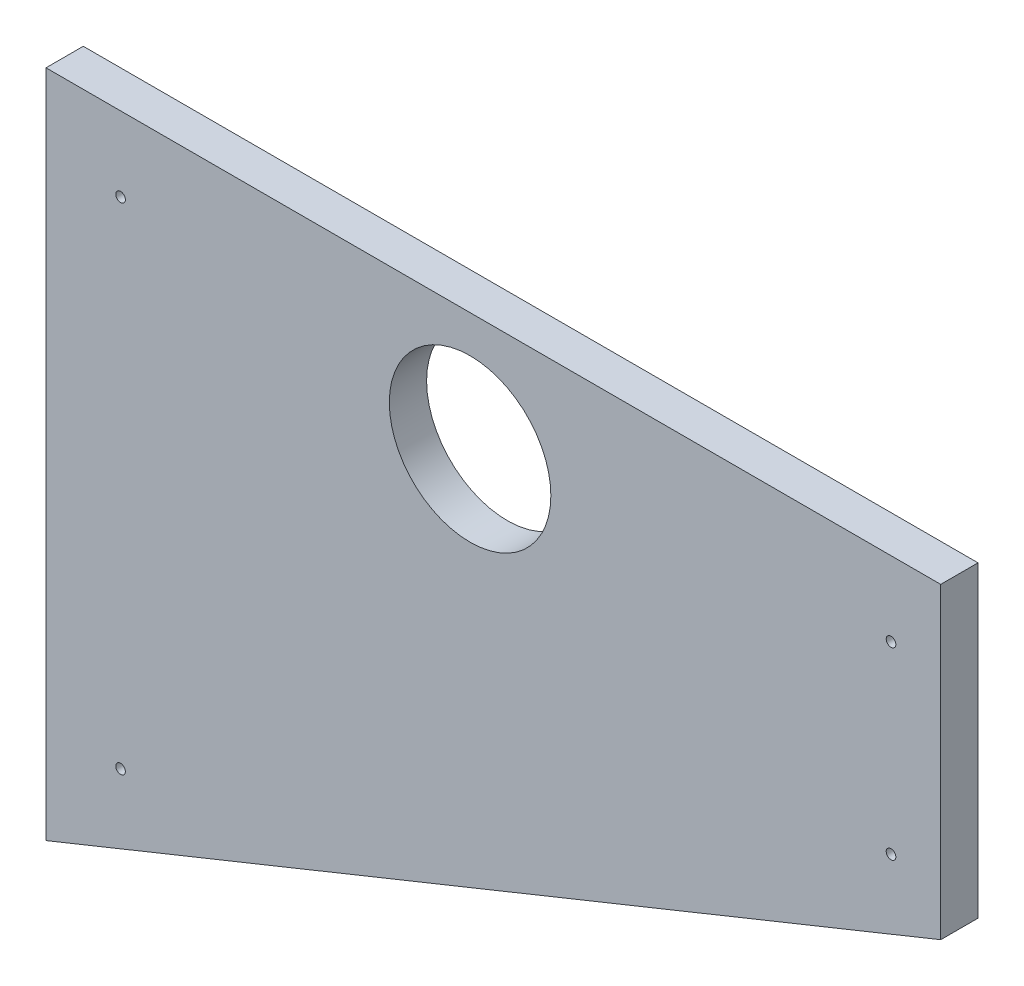
ISO-10303-21;
HEADER;
FILE_DESCRIPTION(('STEP AP214'),'2;1');
FILE_NAME('part.step','',(''),(''),'','','');
FILE_SCHEMA(('AUTOMOTIVE_DESIGN { 1 0 10303 214 1 1 1 1 }'));
ENDSEC;
DATA;
#1=APPLICATION_CONTEXT('core data for automotive mechanical design processes');
#2=APPLICATION_PROTOCOL_DEFINITION('international standard','automotive_design',2000,#1);
#3=PRODUCT_CONTEXT('',#1,'mechanical');
#4=PRODUCT('Part','Part','',(#3));
#5=PRODUCT_RELATED_PRODUCT_CATEGORY('part','',(#4));
#6=PRODUCT_DEFINITION_FORMATION('','',#4);
#7=PRODUCT_DEFINITION_CONTEXT('part definition',#1,'design');
#8=PRODUCT_DEFINITION('design','',#6,#7);
#9=PRODUCT_DEFINITION_SHAPE('','',#8);
#10=(LENGTH_UNIT() NAMED_UNIT(*) SI_UNIT(.MILLI.,.METRE.));
#11=(NAMED_UNIT(*) PLANE_ANGLE_UNIT() SI_UNIT($,.RADIAN.));
#12=(NAMED_UNIT(*) SI_UNIT($,.STERADIAN.) SOLID_ANGLE_UNIT());
#13=UNCERTAINTY_MEASURE_WITH_UNIT(LENGTH_MEASURE(1.E-05),#10,'distance_accuracy_value','');
#14=(GEOMETRIC_REPRESENTATION_CONTEXT(3) GLOBAL_UNCERTAINTY_ASSIGNED_CONTEXT((#13)) GLOBAL_UNIT_ASSIGNED_CONTEXT((#10,
#11,#12)) REPRESENTATION_CONTEXT('',''));
#15=CARTESIAN_POINT('',(0.,0.,0.));
#16=DIRECTION('',(0.,0.,1.));
#17=DIRECTION('',(1.,0.,0.));
#18=AXIS2_PLACEMENT_3D('',#15,#16,#17);
#19=CARTESIAN_POINT('',(3140.70999999981,6983.72999014018,19.05));
#20=DIRECTION('',(0.,-1.,0.));
#21=DIRECTION('',(1.,0.,0.));
#22=AXIS2_PLACEMENT_3D('',#19,#20,#21);
#23=PLANE('',#22);
#24=DIRECTION('',(-1.,0.,0.));
#25=VECTOR('',#24,1.);
#26=CARTESIAN_POINT('',(3140.70999999981,6983.72999014018,0.));
#27=LINE('',#26,#25);
#28=CARTESIAN_POINT('',(3140.70999999981,6983.72999014018,0.));
#29=VERTEX_POINT('',#28);
#30=CARTESIAN_POINT('',(2683.50999999981,6983.72999014018,0.));
#31=VERTEX_POINT('',#30);
#32=EDGE_CURVE('E99',#29,#31,#27,.T.);
#33=ORIENTED_EDGE('',*,*,#32,.T.);
#34=DIRECTION('',(0.,0.,-1.));
#35=VECTOR('',#34,1.);
#36=CARTESIAN_POINT('',(2683.50999999981,6983.72999014018,19.05));
#37=LINE('',#36,#35);
#38=CARTESIAN_POINT('',(2683.50999999981,6983.72999014018,19.05));
#39=VERTEX_POINT('',#38);
#40=EDGE_CURVE('E11',#39,#31,#37,.T.);
#41=ORIENTED_EDGE('',*,*,#40,.F.);
#42=DIRECTION('',(-1.,0.,0.));
#43=VECTOR('',#42,1.);
#44=CARTESIAN_POINT('',(3140.70999999981,6983.72999014018,19.05));
#45=LINE('',#44,#43);
#46=CARTESIAN_POINT('',(3140.70999999981,6983.72999014018,19.05));
#47=VERTEX_POINT('',#46);
#48=EDGE_CURVE('E87',#47,#39,#45,.T.);
#49=ORIENTED_EDGE('',*,*,#48,.F.);
#50=DIRECTION('',(0.,0.,-1.));
#51=VECTOR('',#50,1.);
#52=CARTESIAN_POINT('',(3140.70999999981,6983.72999014018,19.05));
#53=LINE('',#52,#51);
#54=EDGE_CURVE('E95',#47,#29,#53,.T.);
#55=ORIENTED_EDGE('',*,*,#54,.T.);
#56=EDGE_LOOP('',(#33,#41,#49,#55));
#57=FACE_BOUND('',#56,.T.);
#58=ADVANCED_FACE('F36',(#57),#23,.F.);
#59=CARTESIAN_POINT('',(2683.50999999981,6983.72999014018,19.05));
#60=DIRECTION('',(1.,0.,0.));
#61=DIRECTION('',(0.,0.,-1.));
#62=AXIS2_PLACEMENT_3D('',#59,#60,#61);
#63=PLANE('',#62);
#64=DIRECTION('',(0.,-1.,0.));
#65=VECTOR('',#64,1.);
#66=CARTESIAN_POINT('',(2683.50999999981,6983.72999014018,0.));
#67=LINE('',#66,#65);
#68=CARTESIAN_POINT('',(2683.50999999981,6641.74188684795,0.));
#69=VERTEX_POINT('',#68);
#70=EDGE_CURVE('E91',#31,#69,#67,.T.);
#71=ORIENTED_EDGE('',*,*,#70,.T.);
#72=DIRECTION('',(0.,0.,-1.));
#73=VECTOR('',#72,1.);
#74=CARTESIAN_POINT('',(2683.50999999981,6641.74188684795,19.05));
#75=LINE('',#74,#73);
#76=CARTESIAN_POINT('',(2683.50999999981,6641.74188684795,19.05));
#77=VERTEX_POINT('',#76);
#78=EDGE_CURVE('E44',#77,#69,#75,.T.);
#79=ORIENTED_EDGE('',*,*,#78,.F.);
#80=DIRECTION('',(0.,-1.,0.));
#81=VECTOR('',#80,1.);
#82=CARTESIAN_POINT('',(2683.50999999981,6983.72999014018,19.05));
#83=LINE('',#82,#81);
#84=EDGE_CURVE('E82',#39,#77,#83,.T.);
#85=ORIENTED_EDGE('',*,*,#84,.F.);
#86=ORIENTED_EDGE('',*,*,#40,.T.);
#87=EDGE_LOOP('',(#71,#79,#85,#86));
#88=FACE_BOUND('',#87,.T.);
#89=ADVANCED_FACE('F90',(#88),#63,.F.);
#90=CARTESIAN_POINT('',(2683.50999999981,6641.74188684795,19.05));
#91=DIRECTION('',(-0.374606593415956,0.927183854566769,0.));
#92=DIRECTION('',(-0.92718385456677,-0.374606593415956,0.));
#93=AXIS2_PLACEMENT_3D('',#90,#91,#92);
#94=PLANE('',#93);
#95=DIRECTION('',(0.927183854566769,0.374606593415956,0.));
#96=VECTOR('',#95,1.);
#97=CARTESIAN_POINT('',(2683.50999999981,6641.74188684795,0.));
#98=LINE('',#97,#96);
#99=CARTESIAN_POINT('',(3140.70999999981,6826.46267729981,0.));
#100=VERTEX_POINT('',#99);
#101=EDGE_CURVE('E69',#69,#100,#98,.T.);
#102=ORIENTED_EDGE('',*,*,#101,.T.);
#103=DIRECTION('',(0.,0.,-1.));
#104=VECTOR('',#103,1.);
#105=CARTESIAN_POINT('',(3140.70999999981,6826.46267729981,19.05));
#106=LINE('',#105,#104);
#107=CARTESIAN_POINT('',(3140.70999999981,6826.46267729981,19.05));
#108=VERTEX_POINT('',#107);
#109=EDGE_CURVE('E92',#108,#100,#106,.T.);
#110=ORIENTED_EDGE('',*,*,#109,.F.);
#111=DIRECTION('',(0.927183854566769,0.374606593415956,0.));
#112=VECTOR('',#111,1.);
#113=CARTESIAN_POINT('',(2683.50999999981,6641.74188684795,19.05));
#114=LINE('',#113,#112);
#115=EDGE_CURVE('E85',#77,#108,#114,.T.);
#116=ORIENTED_EDGE('',*,*,#115,.F.);
#117=ORIENTED_EDGE('',*,*,#78,.T.);
#118=EDGE_LOOP('',(#102,#110,#116,#117));
#119=FACE_BOUND('',#118,.T.);
#120=ADVANCED_FACE('F93',(#119),#94,.F.);
#121=CARTESIAN_POINT('',(3140.70999999981,6826.46267729981,19.05));
#122=DIRECTION('',(-1.,0.,0.));
#123=DIRECTION('',(0.,0.,1.));
#124=AXIS2_PLACEMENT_3D('',#121,#122,#123);
#125=PLANE('',#124);
#126=DIRECTION('',(0.,1.,0.));
#127=VECTOR('',#126,1.);
#128=CARTESIAN_POINT('',(3140.70999999981,6826.46267729981,0.));
#129=LINE('',#128,#127);
#130=EDGE_CURVE('E75',#100,#29,#129,.T.);
#131=ORIENTED_EDGE('',*,*,#130,.T.);
#132=ORIENTED_EDGE('',*,*,#54,.F.);
#133=DIRECTION('',(0.,1.,0.));
#134=VECTOR('',#133,1.);
#135=CARTESIAN_POINT('',(3140.70999999981,6826.46267729981,19.05));
#136=LINE('',#135,#134);
#137=EDGE_CURVE('E52',#108,#47,#136,.T.);
#138=ORIENTED_EDGE('',*,*,#137,.F.);
#139=ORIENTED_EDGE('',*,*,#109,.T.);
#140=EDGE_LOOP('',(#131,#132,#138,#139));
#141=FACE_BOUND('',#140,.T.);
#142=ADVANCED_FACE('F107',(#141),#125,.F.);
#143=CARTESIAN_POINT('',(0.,0.,19.05));
#144=DIRECTION('',(0.,0.,1.));
#145=DIRECTION('',(1.,0.,0.));
#146=AXIS2_PLACEMENT_3D('',#143,#144,#145);
#147=PLANE('',#146);
#148=CARTESIAN_POINT('',(2900.21804025707,6923.40499014018,19.05));
#149=DIRECTION('',(0.,0.,1.));
#150=DIRECTION('',(1.,0.,0.));
#151=AXIS2_PLACEMENT_3D('',#148,#149,#150);
#152=CIRCLE('',#151,41.2750000000001);
#153=CARTESIAN_POINT('',(2941.49304025707,6923.40499014018,19.05));
#154=VERTEX_POINT('',#153);
#155=EDGE_CURVE('E148',#154,#154,#152,.T.);
#156=ORIENTED_EDGE('',*,*,#155,.F.);
#157=EDGE_LOOP('',(#156));
#158=FACE_BOUND('',#157,.T.);
#159=CARTESIAN_POINT('',(2721.61000000056,6692.54189162913,19.05));
#160=DIRECTION('',(0.,0.,-1.));
#161=DIRECTION('',(-1.,0.,0.));
#162=AXIS2_PLACEMENT_3D('',#159,#160,#161);
#163=CIRCLE('',#162,2.45745000000008);
#164=CARTESIAN_POINT('',(2719.15255000056,6692.54189162913,19.05));
#165=VERTEX_POINT('',#164);
#166=EDGE_CURVE('E139',#165,#165,#163,.T.);
#167=ORIENTED_EDGE('',*,*,#166,.T.);
#168=EDGE_LOOP('',(#167));
#169=FACE_BOUND('',#168,.T.);
#170=CARTESIAN_POINT('',(2721.61000000058,6945.62999492127,19.05));
#171=DIRECTION('',(0.,0.,-1.));
#172=DIRECTION('',(-1.,0.,0.));
#173=AXIS2_PLACEMENT_3D('',#170,#171,#172);
#174=CIRCLE('',#173,2.45745000000008);
#175=CARTESIAN_POINT('',(2719.15255000058,6945.62999492127,19.05));
#176=VERTEX_POINT('',#175);
#177=EDGE_CURVE('E130',#176,#176,#174,.T.);
#178=ORIENTED_EDGE('',*,*,#177,.T.);
#179=EDGE_LOOP('',(#178));
#180=FACE_BOUND('',#179,.T.);
#181=CARTESIAN_POINT('',(3115.31000000058,6945.62999492124,19.05));
#182=DIRECTION('',(0.,0.,-1.));
#183=DIRECTION('',(-1.,0.,0.));
#184=AXIS2_PLACEMENT_3D('',#181,#182,#183);
#185=CIRCLE('',#184,2.45745000000008);
#186=CARTESIAN_POINT('',(3112.85255000058,6945.62999492124,19.05));
#187=VERTEX_POINT('',#186);
#188=EDGE_CURVE('E121',#187,#187,#185,.T.);
#189=ORIENTED_EDGE('',*,*,#188,.T.);
#190=EDGE_LOOP('',(#189));
#191=FACE_BOUND('',#190,.T.);
#192=CARTESIAN_POINT('',(3115.31000000057,6851.60701674041,19.05));
#193=DIRECTION('',(0.,0.,-1.));
#194=DIRECTION('',(-1.,0.,0.));
#195=AXIS2_PLACEMENT_3D('',#192,#193,#194);
#196=CIRCLE('',#195,2.45745000000008);
#197=CARTESIAN_POINT('',(3112.85255000057,6851.60701674041,19.05));
#198=VERTEX_POINT('',#197);
#199=EDGE_CURVE('E102',#198,#198,#196,.T.);
#200=ORIENTED_EDGE('',*,*,#199,.T.);
#201=EDGE_LOOP('',(#200));
#202=FACE_BOUND('',#201,.T.);
#203=ORIENTED_EDGE('',*,*,#48,.T.);
#204=ORIENTED_EDGE('',*,*,#84,.T.);
#205=ORIENTED_EDGE('',*,*,#115,.T.);
#206=ORIENTED_EDGE('',*,*,#137,.T.);
#207=EDGE_LOOP('',(#203,#204,#205,#206));
#208=FACE_BOUND('',#207,.T.);
#209=ADVANCED_FACE('F83',(#158,#169,#180,#191,#202,#208),#147,.T.);
#210=CARTESIAN_POINT('',(0.,0.,0.));
#211=DIRECTION('',(0.,0.,1.));
#212=DIRECTION('',(1.,0.,0.));
#213=AXIS2_PLACEMENT_3D('',#210,#211,#212);
#214=PLANE('',#213);
#215=CARTESIAN_POINT('',(2900.21804025707,6923.40499014018,0.));
#216=DIRECTION('',(0.,0.,-1.));
#217=DIRECTION('',(-1.,0.,0.));
#218=AXIS2_PLACEMENT_3D('',#215,#216,#217);
#219=CIRCLE('',#218,41.2750000000001);
#220=CARTESIAN_POINT('',(2858.94304025707,6923.40499014018,0.));
#221=VERTEX_POINT('',#220);
#222=EDGE_CURVE('E151',#221,#221,#219,.T.);
#223=ORIENTED_EDGE('',*,*,#222,.F.);
#224=EDGE_LOOP('',(#223));
#225=FACE_BOUND('',#224,.T.);
#226=CARTESIAN_POINT('',(2721.61000000056,6692.54189162913,0.));
#227=DIRECTION('',(0.,0.,-1.));
#228=DIRECTION('',(-1.,0.,0.));
#229=AXIS2_PLACEMENT_3D('',#226,#227,#228);
#230=CIRCLE('',#229,4.21639999999979);
#231=CARTESIAN_POINT('',(2717.39360000056,6692.54189162913,0.));
#232=VERTEX_POINT('',#231);
#233=EDGE_CURVE('E145',#232,#232,#230,.T.);
#234=ORIENTED_EDGE('',*,*,#233,.F.);
#235=EDGE_LOOP('',(#234));
#236=FACE_BOUND('',#235,.T.);
#237=CARTESIAN_POINT('',(2721.61000000058,6945.62999492127,0.));
#238=DIRECTION('',(0.,0.,-1.));
#239=DIRECTION('',(-1.,0.,0.));
#240=AXIS2_PLACEMENT_3D('',#237,#238,#239);
#241=CIRCLE('',#240,4.21639999999979);
#242=CARTESIAN_POINT('',(2717.39360000058,6945.62999492127,0.));
#243=VERTEX_POINT('',#242);
#244=EDGE_CURVE('E136',#243,#243,#241,.T.);
#245=ORIENTED_EDGE('',*,*,#244,.F.);
#246=EDGE_LOOP('',(#245));
#247=FACE_BOUND('',#246,.T.);
#248=CARTESIAN_POINT('',(3115.31000000058,6945.62999492124,0.));
#249=DIRECTION('',(0.,0.,-1.));
#250=DIRECTION('',(-1.,0.,0.));
#251=AXIS2_PLACEMENT_3D('',#248,#249,#250);
#252=CIRCLE('',#251,4.21639999999979);
#253=CARTESIAN_POINT('',(3111.09360000058,6945.62999492124,0.));
#254=VERTEX_POINT('',#253);
#255=EDGE_CURVE('E127',#254,#254,#252,.T.);
#256=ORIENTED_EDGE('',*,*,#255,.F.);
#257=EDGE_LOOP('',(#256));
#258=FACE_BOUND('',#257,.T.);
#259=CARTESIAN_POINT('',(3115.31000000057,6851.60701674041,0.));
#260=DIRECTION('',(0.,0.,-1.));
#261=DIRECTION('',(-1.,0.,0.));
#262=AXIS2_PLACEMENT_3D('',#259,#260,#261);
#263=CIRCLE('',#262,4.21639999999979);
#264=CARTESIAN_POINT('',(3111.09360000057,6851.60701674041,0.));
#265=VERTEX_POINT('',#264);
#266=EDGE_CURVE('E118',#265,#265,#263,.T.);
#267=ORIENTED_EDGE('',*,*,#266,.F.);
#268=EDGE_LOOP('',(#267));
#269=FACE_BOUND('',#268,.T.);
#270=ORIENTED_EDGE('',*,*,#32,.F.);
#271=ORIENTED_EDGE('',*,*,#130,.F.);
#272=ORIENTED_EDGE('',*,*,#101,.F.);
#273=ORIENTED_EDGE('',*,*,#70,.F.);
#274=EDGE_LOOP('',(#270,#271,#272,#273));
#275=FACE_BOUND('',#274,.T.);
#276=ADVANCED_FACE('F110',(#225,#236,#247,#258,#269,#275),#214,.F.);
#277=CARTESIAN_POINT('',(3115.31000000057,6851.60701674041,0.));
#278=DIRECTION('',(0.,0.,-1.));
#279=DIRECTION('',(-1.,0.,0.));
#280=AXIS2_PLACEMENT_3D('',#277,#278,#279);
#281=CYLINDRICAL_SURFACE('',#280,2.45745000000008);
#282=ORIENTED_EDGE('',*,*,#199,.F.);
#283=EDGE_LOOP('',(#282));
#284=FACE_BOUND('',#283,.T.);
#285=CARTESIAN_POINT('',(3115.31000000057,6851.60701674041,1.47593429625929));
#286=DIRECTION('',(0.,0.,-1.));
#287=DIRECTION('',(-1.,0.,0.));
#288=AXIS2_PLACEMENT_3D('',#285,#286,#287);
#289=CIRCLE('',#288,2.45745000000008);
#290=CARTESIAN_POINT('',(3112.85255000057,6851.60701674041,1.47593429625929));
#291=VERTEX_POINT('',#290);
#292=EDGE_CURVE('E115',#291,#291,#289,.T.);
#293=ORIENTED_EDGE('',*,*,#292,.T.);
#294=EDGE_LOOP('',(#293));
#295=FACE_BOUND('',#294,.T.);
#296=ADVANCED_FACE('F159',(#284,#295),#281,.F.);
#297=CARTESIAN_POINT('',(3115.31000000057,6851.60701674041,0.));
#298=DIRECTION('',(0.,0.,-1.));
#299=DIRECTION('',(-1.,0.,0.));
#300=AXIS2_PLACEMENT_3D('',#297,#298,#299);
#301=CONICAL_SURFACE('',#300,4.21639999999979,0.872664625997076);
#302=ORIENTED_EDGE('',*,*,#292,.F.);
#303=EDGE_LOOP('',(#302));
#304=FACE_BOUND('',#303,.T.);
#305=ORIENTED_EDGE('',*,*,#266,.T.);
#306=EDGE_LOOP('',(#305));
#307=FACE_BOUND('',#306,.T.);
#308=ADVANCED_FACE('F169',(#304,#307),#301,.F.);
#309=CARTESIAN_POINT('',(3115.31000000058,6945.62999492124,0.));
#310=DIRECTION('',(0.,0.,-1.));
#311=DIRECTION('',(-1.,0.,0.));
#312=AXIS2_PLACEMENT_3D('',#309,#310,#311);
#313=CYLINDRICAL_SURFACE('',#312,2.45745000000008);
#314=ORIENTED_EDGE('',*,*,#188,.F.);
#315=EDGE_LOOP('',(#314));
#316=FACE_BOUND('',#315,.T.);
#317=CARTESIAN_POINT('',(3115.31000000058,6945.62999492124,1.47593429625929));
#318=DIRECTION('',(0.,0.,-1.));
#319=DIRECTION('',(-1.,0.,0.));
#320=AXIS2_PLACEMENT_3D('',#317,#318,#319);
#321=CIRCLE('',#320,2.45745000000008);
#322=CARTESIAN_POINT('',(3112.85255000058,6945.62999492124,1.47593429625929));
#323=VERTEX_POINT('',#322);
#324=EDGE_CURVE('E124',#323,#323,#321,.T.);
#325=ORIENTED_EDGE('',*,*,#324,.T.);
#326=EDGE_LOOP('',(#325));
#327=FACE_BOUND('',#326,.T.);
#328=ADVANCED_FACE('F171',(#316,#327),#313,.F.);
#329=CARTESIAN_POINT('',(3115.31000000058,6945.62999492124,0.));
#330=DIRECTION('',(0.,0.,-1.));
#331=DIRECTION('',(-1.,0.,0.));
#332=AXIS2_PLACEMENT_3D('',#329,#330,#331);
#333=CONICAL_SURFACE('',#332,4.21639999999979,0.872664625997076);
#334=ORIENTED_EDGE('',*,*,#324,.F.);
#335=EDGE_LOOP('',(#334));
#336=FACE_BOUND('',#335,.T.);
#337=ORIENTED_EDGE('',*,*,#255,.T.);
#338=EDGE_LOOP('',(#337));
#339=FACE_BOUND('',#338,.T.);
#340=ADVANCED_FACE('F178',(#336,#339),#333,.F.);
#341=CARTESIAN_POINT('',(2721.61000000058,6945.62999492127,0.));
#342=DIRECTION('',(0.,0.,-1.));
#343=DIRECTION('',(-1.,0.,0.));
#344=AXIS2_PLACEMENT_3D('',#341,#342,#343);
#345=CYLINDRICAL_SURFACE('',#344,2.45745000000008);
#346=ORIENTED_EDGE('',*,*,#177,.F.);
#347=EDGE_LOOP('',(#346));
#348=FACE_BOUND('',#347,.T.);
#349=CARTESIAN_POINT('',(2721.61000000058,6945.62999492127,1.47593429625929));
#350=DIRECTION('',(0.,0.,-1.));
#351=DIRECTION('',(-1.,0.,0.));
#352=AXIS2_PLACEMENT_3D('',#349,#350,#351);
#353=CIRCLE('',#352,2.45745000000008);
#354=CARTESIAN_POINT('',(2719.15255000058,6945.62999492127,1.47593429625929));
#355=VERTEX_POINT('',#354);
#356=EDGE_CURVE('E133',#355,#355,#353,.T.);
#357=ORIENTED_EDGE('',*,*,#356,.T.);
#358=EDGE_LOOP('',(#357));
#359=FACE_BOUND('',#358,.T.);
#360=ADVANCED_FACE('F214',(#348,#359),#345,.F.);
#361=CARTESIAN_POINT('',(2721.61000000058,6945.62999492127,0.));
#362=DIRECTION('',(0.,0.,-1.));
#363=DIRECTION('',(-1.,0.,0.));
#364=AXIS2_PLACEMENT_3D('',#361,#362,#363);
#365=CONICAL_SURFACE('',#364,4.21639999999979,0.872664625997076);
#366=ORIENTED_EDGE('',*,*,#356,.F.);
#367=EDGE_LOOP('',(#366));
#368=FACE_BOUND('',#367,.T.);
#369=ORIENTED_EDGE('',*,*,#244,.T.);
#370=EDGE_LOOP('',(#369));
#371=FACE_BOUND('',#370,.T.);
#372=ADVANCED_FACE('F219',(#368,#371),#365,.F.);
#373=CARTESIAN_POINT('',(2721.61000000056,6692.54189162913,0.));
#374=DIRECTION('',(0.,0.,-1.));
#375=DIRECTION('',(-1.,0.,0.));
#376=AXIS2_PLACEMENT_3D('',#373,#374,#375);
#377=CYLINDRICAL_SURFACE('',#376,2.45745000000008);
#378=ORIENTED_EDGE('',*,*,#166,.F.);
#379=EDGE_LOOP('',(#378));
#380=FACE_BOUND('',#379,.T.);
#381=CARTESIAN_POINT('',(2721.61000000056,6692.54189162913,1.47593429625929));
#382=DIRECTION('',(0.,0.,-1.));
#383=DIRECTION('',(-1.,0.,0.));
#384=AXIS2_PLACEMENT_3D('',#381,#382,#383);
#385=CIRCLE('',#384,2.45745000000008);
#386=CARTESIAN_POINT('',(2719.15255000056,6692.54189162913,1.47593429625929));
#387=VERTEX_POINT('',#386);
#388=EDGE_CURVE('E142',#387,#387,#385,.T.);
#389=ORIENTED_EDGE('',*,*,#388,.T.);
#390=EDGE_LOOP('',(#389));
#391=FACE_BOUND('',#390,.T.);
#392=ADVANCED_FACE('F225',(#380,#391),#377,.F.);
#393=CARTESIAN_POINT('',(2721.61000000056,6692.54189162913,0.));
#394=DIRECTION('',(0.,0.,-1.));
#395=DIRECTION('',(-1.,0.,0.));
#396=AXIS2_PLACEMENT_3D('',#393,#394,#395);
#397=CONICAL_SURFACE('',#396,4.21639999999979,0.872664625997076);
#398=ORIENTED_EDGE('',*,*,#388,.F.);
#399=EDGE_LOOP('',(#398));
#400=FACE_BOUND('',#399,.T.);
#401=ORIENTED_EDGE('',*,*,#233,.T.);
#402=EDGE_LOOP('',(#401));
#403=FACE_BOUND('',#402,.T.);
#404=ADVANCED_FACE('F229',(#400,#403),#397,.F.);
#405=CARTESIAN_POINT('',(2900.21804025707,6923.40499014018,38.1));
#406=DIRECTION('',(0.,0.,-1.));
#407=DIRECTION('',(-1.,0.,0.));
#408=AXIS2_PLACEMENT_3D('',#405,#406,#407);
#409=CYLINDRICAL_SURFACE('',#408,41.2750000000001);
#410=ORIENTED_EDGE('',*,*,#155,.T.);
#411=EDGE_LOOP('',(#410));
#412=FACE_BOUND('',#411,.T.);
#413=ORIENTED_EDGE('',*,*,#222,.T.);
#414=EDGE_LOOP('',(#413));
#415=FACE_BOUND('',#414,.T.);
#416=ADVANCED_FACE('F155',(#412,#415),#409,.F.);
#417=CLOSED_SHELL('',(#58,#89,#120,#142,#209,#276,#296,#308,#328,#340,#360,#372,#392,#404,#416));
#418=MANIFOLD_SOLID_BREP('B2',#417);
#419=ADVANCED_BREP_SHAPE_REPRESENTATION('',(#18,#418),#14);
#420=SHAPE_DEFINITION_REPRESENTATION(#9,#419);
ENDSEC;
END-ISO-10303-21;
